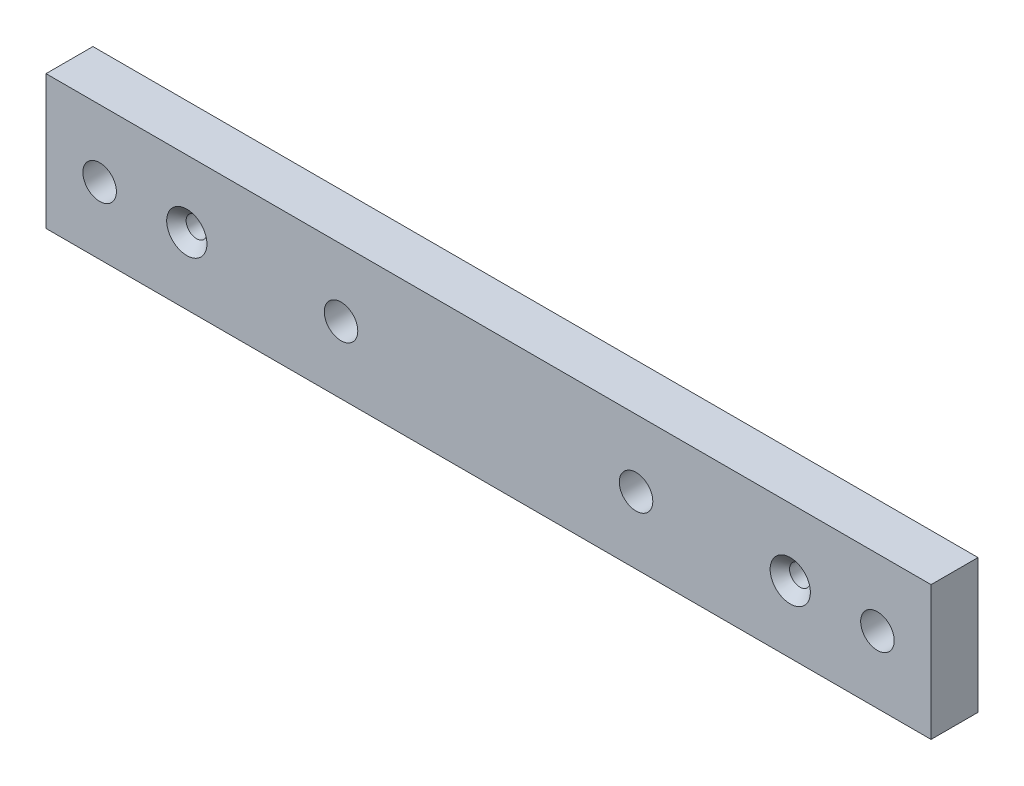
ISO-10303-21;
HEADER;
FILE_DESCRIPTION(('STEP AP214'),'2;1');
FILE_NAME('part.step','',(''),(''),'','','');
FILE_SCHEMA(('AUTOMOTIVE_DESIGN { 1 0 10303 214 1 1 1 1 }'));
ENDSEC;
DATA;
#1=APPLICATION_CONTEXT('core data for automotive mechanical design processes');
#2=APPLICATION_PROTOCOL_DEFINITION('international standard','automotive_design',2000,#1);
#3=PRODUCT_CONTEXT('',#1,'mechanical');
#4=PRODUCT('Part','Part','',(#3));
#5=PRODUCT_RELATED_PRODUCT_CATEGORY('part','',(#4));
#6=PRODUCT_DEFINITION_FORMATION('','',#4);
#7=PRODUCT_DEFINITION_CONTEXT('part definition',#1,'design');
#8=PRODUCT_DEFINITION('design','',#6,#7);
#9=PRODUCT_DEFINITION_SHAPE('','',#8);
#10=(LENGTH_UNIT() NAMED_UNIT(*) SI_UNIT(.MILLI.,.METRE.));
#11=(NAMED_UNIT(*) PLANE_ANGLE_UNIT() SI_UNIT($,.RADIAN.));
#12=(NAMED_UNIT(*) SI_UNIT($,.STERADIAN.) SOLID_ANGLE_UNIT());
#13=UNCERTAINTY_MEASURE_WITH_UNIT(LENGTH_MEASURE(1.E-05),#10,'distance_accuracy_value','');
#14=(GEOMETRIC_REPRESENTATION_CONTEXT(3) GLOBAL_UNCERTAINTY_ASSIGNED_CONTEXT((#13)) GLOBAL_UNIT_ASSIGNED_CONTEXT((#10,
#11,#12)) REPRESENTATION_CONTEXT('',''));
#15=CARTESIAN_POINT('',(0.,0.,0.));
#16=DIRECTION('',(0.,0.,1.));
#17=DIRECTION('',(1.,0.,0.));
#18=AXIS2_PLACEMENT_3D('',#15,#16,#17);
#19=CARTESIAN_POINT('',(0.,0.,7.));
#20=DIRECTION('',(0.,0.,-1.));
#21=DIRECTION('',(-1.,0.,0.));
#22=AXIS2_PLACEMENT_3D('',#19,#20,#21);
#23=PLANE('',#22);
#24=CARTESIAN_POINT('',(-58.,0.,7.));
#25=DIRECTION('',(0.,0.,1.));
#26=DIRECTION('',(1.,0.,0.));
#27=AXIS2_PLACEMENT_3D('',#24,#25,#26);
#28=CIRCLE('',#27,2.5);
#29=CARTESIAN_POINT('',(-55.5,0.,7.));
#30=VERTEX_POINT('',#29);
#31=EDGE_CURVE('E127',#30,#30,#28,.T.);
#32=ORIENTED_EDGE('',*,*,#31,.F.);
#33=EDGE_LOOP('',(#32));
#34=FACE_BOUND('',#33,.T.);
#35=CARTESIAN_POINT('',(58.,0.,7.));
#36=DIRECTION('',(0.,0.,1.));
#37=DIRECTION('',(1.,0.,0.));
#38=AXIS2_PLACEMENT_3D('',#35,#36,#37);
#39=CIRCLE('',#38,2.49999999999999);
#40=CARTESIAN_POINT('',(60.5,0.,7.));
#41=VERTEX_POINT('',#40);
#42=EDGE_CURVE('E121',#41,#41,#39,.T.);
#43=ORIENTED_EDGE('',*,*,#42,.F.);
#44=EDGE_LOOP('',(#43));
#45=FACE_BOUND('',#44,.T.);
#46=CARTESIAN_POINT('',(22.,0.,7.));
#47=DIRECTION('',(0.,0.,1.));
#48=DIRECTION('',(1.,0.,0.));
#49=AXIS2_PLACEMENT_3D('',#46,#47,#48);
#50=CIRCLE('',#49,2.5);
#51=CARTESIAN_POINT('',(24.5,0.,7.));
#52=VERTEX_POINT('',#51);
#53=EDGE_CURVE('E115',#52,#52,#50,.T.);
#54=ORIENTED_EDGE('',*,*,#53,.F.);
#55=EDGE_LOOP('',(#54));
#56=FACE_BOUND('',#55,.T.);
#57=CARTESIAN_POINT('',(-22.,0.,7.));
#58=DIRECTION('',(0.,0.,1.));
#59=DIRECTION('',(1.,0.,0.));
#60=AXIS2_PLACEMENT_3D('',#57,#58,#59);
#61=CIRCLE('',#60,2.5);
#62=CARTESIAN_POINT('',(-19.5,0.,7.));
#63=VERTEX_POINT('',#62);
#64=EDGE_CURVE('E100',#63,#63,#61,.T.);
#65=ORIENTED_EDGE('',*,*,#64,.F.);
#66=EDGE_LOOP('',(#65));
#67=FACE_BOUND('',#66,.T.);
#68=DIRECTION('',(0.,1.,0.));
#69=VECTOR('',#68,1.);
#70=CARTESIAN_POINT('',(66.,-10.,7.));
#71=LINE('',#70,#69);
#72=CARTESIAN_POINT('',(66.,-10.,7.));
#73=VERTEX_POINT('',#72);
#74=CARTESIAN_POINT('',(66.,10.,7.));
#75=VERTEX_POINT('',#74);
#76=EDGE_CURVE('E85',#73,#75,#71,.T.);
#77=ORIENTED_EDGE('',*,*,#76,.T.);
#78=DIRECTION('',(-1.,0.,0.));
#79=VECTOR('',#78,1.);
#80=CARTESIAN_POINT('',(-66.,10.,7.));
#81=LINE('',#80,#79);
#82=CARTESIAN_POINT('',(-66.,10.,7.));
#83=VERTEX_POINT('',#82);
#84=EDGE_CURVE('E80',#75,#83,#81,.T.);
#85=ORIENTED_EDGE('',*,*,#84,.T.);
#86=DIRECTION('',(0.,-1.,0.));
#87=VECTOR('',#86,1.);
#88=CARTESIAN_POINT('',(-66.,-10.,7.));
#89=LINE('',#88,#87);
#90=CARTESIAN_POINT('',(-66.,-10.,7.));
#91=VERTEX_POINT('',#90);
#92=EDGE_CURVE('E83',#83,#91,#89,.T.);
#93=ORIENTED_EDGE('',*,*,#92,.T.);
#94=DIRECTION('',(1.,0.,0.));
#95=VECTOR('',#94,1.);
#96=CARTESIAN_POINT('',(-66.,-10.,7.));
#97=LINE('',#96,#95);
#98=EDGE_CURVE('E50',#91,#73,#97,.T.);
#99=ORIENTED_EDGE('',*,*,#98,.T.);
#100=EDGE_LOOP('',(#77,#85,#93,#99));
#101=FACE_BOUND('',#100,.T.);
#102=CARTESIAN_POINT('',(45.,0.,7.));
#103=DIRECTION('',(0.,0.,1.));
#104=DIRECTION('',(1.,0.,0.));
#105=AXIS2_PLACEMENT_3D('',#102,#103,#104);
#106=CIRCLE('',#105,3.);
#107=CARTESIAN_POINT('',(48.,0.,7.));
#108=VERTEX_POINT('',#107);
#109=EDGE_CURVE('E141',#108,#108,#106,.T.);
#110=ORIENTED_EDGE('',*,*,#109,.F.);
#111=EDGE_LOOP('',(#110));
#112=FACE_BOUND('',#111,.T.);
#113=CARTESIAN_POINT('',(-45.,0.,7.));
#114=DIRECTION('',(0.,0.,1.));
#115=DIRECTION('',(1.,0.,0.));
#116=AXIS2_PLACEMENT_3D('',#113,#114,#115);
#117=CIRCLE('',#116,3.);
#118=CARTESIAN_POINT('',(-42.,0.,7.));
#119=VERTEX_POINT('',#118);
#120=EDGE_CURVE('E150',#119,#119,#117,.T.);
#121=ORIENTED_EDGE('',*,*,#120,.F.);
#122=EDGE_LOOP('',(#121));
#123=FACE_BOUND('',#122,.T.);
#124=ADVANCED_FACE('F33',(#34,#45,#56,#67,#101,#112,#123),#23,.F.);
#125=CARTESIAN_POINT('',(0.,0.,0.));
#126=DIRECTION('',(0.,0.,-1.));
#127=DIRECTION('',(-1.,0.,0.));
#128=AXIS2_PLACEMENT_3D('',#125,#126,#127);
#129=PLANE('',#128);
#130=CARTESIAN_POINT('',(-45.,0.,0.));
#131=DIRECTION('',(0.,0.,1.));
#132=DIRECTION('',(1.,0.,0.));
#133=AXIS2_PLACEMENT_3D('',#130,#131,#132);
#134=CIRCLE('',#133,1.55);
#135=CARTESIAN_POINT('',(-43.45,0.,0.));
#136=VERTEX_POINT('',#135);
#137=EDGE_CURVE('E144',#136,#136,#134,.T.);
#138=ORIENTED_EDGE('',*,*,#137,.T.);
#139=EDGE_LOOP('',(#138));
#140=FACE_BOUND('',#139,.T.);
#141=CARTESIAN_POINT('',(-58.,0.,0.));
#142=DIRECTION('',(0.,0.,1.));
#143=DIRECTION('',(1.,0.,0.));
#144=AXIS2_PLACEMENT_3D('',#141,#142,#143);
#145=CIRCLE('',#144,2.5);
#146=CARTESIAN_POINT('',(-55.5,0.,0.));
#147=VERTEX_POINT('',#146);
#148=EDGE_CURVE('E130',#147,#147,#145,.T.);
#149=ORIENTED_EDGE('',*,*,#148,.T.);
#150=EDGE_LOOP('',(#149));
#151=FACE_BOUND('',#150,.T.);
#152=CARTESIAN_POINT('',(22.,0.,0.));
#153=DIRECTION('',(0.,0.,1.));
#154=DIRECTION('',(1.,0.,0.));
#155=AXIS2_PLACEMENT_3D('',#152,#153,#154);
#156=CIRCLE('',#155,2.5);
#157=CARTESIAN_POINT('',(24.5,0.,0.));
#158=VERTEX_POINT('',#157);
#159=EDGE_CURVE('E118',#158,#158,#156,.T.);
#160=ORIENTED_EDGE('',*,*,#159,.T.);
#161=EDGE_LOOP('',(#160));
#162=FACE_BOUND('',#161,.T.);
#163=DIRECTION('',(0.,1.,0.));
#164=VECTOR('',#163,1.);
#165=CARTESIAN_POINT('',(66.,-10.,0.));
#166=LINE('',#165,#164);
#167=CARTESIAN_POINT('',(66.,-10.,0.));
#168=VERTEX_POINT('',#167);
#169=CARTESIAN_POINT('',(66.,10.,0.));
#170=VERTEX_POINT('',#169);
#171=EDGE_CURVE('E97',#168,#170,#166,.T.);
#172=ORIENTED_EDGE('',*,*,#171,.F.);
#173=DIRECTION('',(1.,0.,0.));
#174=VECTOR('',#173,1.);
#175=CARTESIAN_POINT('',(-66.,-10.,0.));
#176=LINE('',#175,#174);
#177=CARTESIAN_POINT('',(-66.,-10.,0.));
#178=VERTEX_POINT('',#177);
#179=EDGE_CURVE('E73',#178,#168,#176,.T.);
#180=ORIENTED_EDGE('',*,*,#179,.F.);
#181=DIRECTION('',(0.,-1.,0.));
#182=VECTOR('',#181,1.);
#183=CARTESIAN_POINT('',(-66.,-10.,0.));
#184=LINE('',#183,#182);
#185=CARTESIAN_POINT('',(-66.,10.,0.));
#186=VERTEX_POINT('',#185);
#187=EDGE_CURVE('E67',#186,#178,#184,.T.);
#188=ORIENTED_EDGE('',*,*,#187,.F.);
#189=DIRECTION('',(-1.,0.,0.));
#190=VECTOR('',#189,1.);
#191=CARTESIAN_POINT('',(-66.,10.,0.));
#192=LINE('',#191,#190);
#193=EDGE_CURVE('E89',#170,#186,#192,.T.);
#194=ORIENTED_EDGE('',*,*,#193,.F.);
#195=EDGE_LOOP('',(#172,#180,#188,#194));
#196=FACE_BOUND('',#195,.T.);
#197=CARTESIAN_POINT('',(-22.,0.,0.));
#198=DIRECTION('',(0.,0.,1.));
#199=DIRECTION('',(1.,0.,0.));
#200=AXIS2_PLACEMENT_3D('',#197,#198,#199);
#201=CIRCLE('',#200,2.5);
#202=CARTESIAN_POINT('',(-19.5,0.,0.));
#203=VERTEX_POINT('',#202);
#204=EDGE_CURVE('E112',#203,#203,#201,.T.);
#205=ORIENTED_EDGE('',*,*,#204,.T.);
#206=EDGE_LOOP('',(#205));
#207=FACE_BOUND('',#206,.T.);
#208=CARTESIAN_POINT('',(58.,0.,0.));
#209=DIRECTION('',(0.,0.,1.));
#210=DIRECTION('',(1.,0.,0.));
#211=AXIS2_PLACEMENT_3D('',#208,#209,#210);
#212=CIRCLE('',#211,2.49999999999999);
#213=CARTESIAN_POINT('',(60.5,0.,0.));
#214=VERTEX_POINT('',#213);
#215=EDGE_CURVE('E124',#214,#214,#212,.T.);
#216=ORIENTED_EDGE('',*,*,#215,.T.);
#217=EDGE_LOOP('',(#216));
#218=FACE_BOUND('',#217,.T.);
#219=CARTESIAN_POINT('',(45.,0.,0.));
#220=DIRECTION('',(0.,0.,1.));
#221=DIRECTION('',(1.,0.,0.));
#222=AXIS2_PLACEMENT_3D('',#219,#220,#221);
#223=CIRCLE('',#222,1.55);
#224=CARTESIAN_POINT('',(46.55,0.,0.));
#225=VERTEX_POINT('',#224);
#226=EDGE_CURVE('E133',#225,#225,#223,.T.);
#227=ORIENTED_EDGE('',*,*,#226,.T.);
#228=EDGE_LOOP('',(#227));
#229=FACE_BOUND('',#228,.T.);
#230=ADVANCED_FACE('F108',(#140,#151,#162,#196,#207,#218,#229),#129,.T.);
#231=CARTESIAN_POINT('',(66.,-10.,7.));
#232=DIRECTION('',(-1.,0.,0.));
#233=DIRECTION('',(0.,0.,1.));
#234=AXIS2_PLACEMENT_3D('',#231,#232,#233);
#235=PLANE('',#234);
#236=ORIENTED_EDGE('',*,*,#171,.T.);
#237=DIRECTION('',(0.,0.,-1.));
#238=VECTOR('',#237,1.);
#239=CARTESIAN_POINT('',(66.,10.,7.));
#240=LINE('',#239,#238);
#241=EDGE_CURVE('E11',#75,#170,#240,.T.);
#242=ORIENTED_EDGE('',*,*,#241,.F.);
#243=ORIENTED_EDGE('',*,*,#76,.F.);
#244=DIRECTION('',(0.,0.,-1.));
#245=VECTOR('',#244,1.);
#246=CARTESIAN_POINT('',(66.,-10.,7.));
#247=LINE('',#246,#245);
#248=EDGE_CURVE('E93',#73,#168,#247,.T.);
#249=ORIENTED_EDGE('',*,*,#248,.T.);
#250=EDGE_LOOP('',(#236,#242,#243,#249));
#251=FACE_BOUND('',#250,.T.);
#252=ADVANCED_FACE('F35',(#251),#235,.F.);
#253=CARTESIAN_POINT('',(-66.,10.,7.));
#254=DIRECTION('',(0.,-1.,0.));
#255=DIRECTION('',(0.,0.,-1.));
#256=AXIS2_PLACEMENT_3D('',#253,#254,#255);
#257=PLANE('',#256);
#258=ORIENTED_EDGE('',*,*,#193,.T.);
#259=DIRECTION('',(0.,0.,-1.));
#260=VECTOR('',#259,1.);
#261=CARTESIAN_POINT('',(-66.,10.,7.));
#262=LINE('',#261,#260);
#263=EDGE_CURVE('E42',#83,#186,#262,.T.);
#264=ORIENTED_EDGE('',*,*,#263,.F.);
#265=ORIENTED_EDGE('',*,*,#84,.F.);
#266=ORIENTED_EDGE('',*,*,#241,.T.);
#267=EDGE_LOOP('',(#258,#264,#265,#266));
#268=FACE_BOUND('',#267,.T.);
#269=ADVANCED_FACE('F88',(#268),#257,.F.);
#270=CARTESIAN_POINT('',(-66.,-10.,7.));
#271=DIRECTION('',(1.,0.,0.));
#272=DIRECTION('',(0.,0.,-1.));
#273=AXIS2_PLACEMENT_3D('',#270,#271,#272);
#274=PLANE('',#273);
#275=ORIENTED_EDGE('',*,*,#187,.T.);
#276=DIRECTION('',(0.,0.,-1.));
#277=VECTOR('',#276,1.);
#278=CARTESIAN_POINT('',(-66.,-10.,7.));
#279=LINE('',#278,#277);
#280=EDGE_CURVE('E90',#91,#178,#279,.T.);
#281=ORIENTED_EDGE('',*,*,#280,.F.);
#282=ORIENTED_EDGE('',*,*,#92,.F.);
#283=ORIENTED_EDGE('',*,*,#263,.T.);
#284=EDGE_LOOP('',(#275,#281,#282,#283));
#285=FACE_BOUND('',#284,.T.);
#286=ADVANCED_FACE('F91',(#285),#274,.F.);
#287=CARTESIAN_POINT('',(-66.,-10.,7.));
#288=DIRECTION('',(0.,1.,0.));
#289=DIRECTION('',(0.,0.,1.));
#290=AXIS2_PLACEMENT_3D('',#287,#288,#289);
#291=PLANE('',#290);
#292=ORIENTED_EDGE('',*,*,#179,.T.);
#293=ORIENTED_EDGE('',*,*,#248,.F.);
#294=ORIENTED_EDGE('',*,*,#98,.F.);
#295=ORIENTED_EDGE('',*,*,#280,.T.);
#296=EDGE_LOOP('',(#292,#293,#294,#295));
#297=FACE_BOUND('',#296,.T.);
#298=ADVANCED_FACE('F105',(#297),#291,.F.);
#299=CARTESIAN_POINT('',(-22.,0.,7.));
#300=DIRECTION('',(0.,0.,-1.));
#301=DIRECTION('',(-1.,0.,0.));
#302=AXIS2_PLACEMENT_3D('',#299,#300,#301);
#303=CYLINDRICAL_SURFACE('',#302,2.5);
#304=ORIENTED_EDGE('',*,*,#64,.T.);
#305=EDGE_LOOP('',(#304));
#306=FACE_BOUND('',#305,.T.);
#307=ORIENTED_EDGE('',*,*,#204,.F.);
#308=EDGE_LOOP('',(#307));
#309=FACE_BOUND('',#308,.T.);
#310=ADVANCED_FACE('F167',(#306,#309),#303,.F.);
#311=CARTESIAN_POINT('',(22.,0.,7.));
#312=DIRECTION('',(0.,0.,-1.));
#313=DIRECTION('',(-1.,0.,0.));
#314=AXIS2_PLACEMENT_3D('',#311,#312,#313);
#315=CYLINDRICAL_SURFACE('',#314,2.5);
#316=ORIENTED_EDGE('',*,*,#53,.T.);
#317=EDGE_LOOP('',(#316));
#318=FACE_BOUND('',#317,.T.);
#319=ORIENTED_EDGE('',*,*,#159,.F.);
#320=EDGE_LOOP('',(#319));
#321=FACE_BOUND('',#320,.T.);
#322=ADVANCED_FACE('F238',(#318,#321),#315,.F.);
#323=CARTESIAN_POINT('',(58.,0.,7.));
#324=DIRECTION('',(0.,0.,-1.));
#325=DIRECTION('',(-1.,0.,0.));
#326=AXIS2_PLACEMENT_3D('',#323,#324,#325);
#327=CYLINDRICAL_SURFACE('',#326,2.49999999999999);
#328=ORIENTED_EDGE('',*,*,#42,.T.);
#329=EDGE_LOOP('',(#328));
#330=FACE_BOUND('',#329,.T.);
#331=ORIENTED_EDGE('',*,*,#215,.F.);
#332=EDGE_LOOP('',(#331));
#333=FACE_BOUND('',#332,.T.);
#334=ADVANCED_FACE('F235',(#330,#333),#327,.F.);
#335=CARTESIAN_POINT('',(-58.,0.,7.));
#336=DIRECTION('',(0.,0.,-1.));
#337=DIRECTION('',(-1.,0.,0.));
#338=AXIS2_PLACEMENT_3D('',#335,#336,#337);
#339=CYLINDRICAL_SURFACE('',#338,2.5);
#340=ORIENTED_EDGE('',*,*,#31,.T.);
#341=EDGE_LOOP('',(#340));
#342=FACE_BOUND('',#341,.T.);
#343=ORIENTED_EDGE('',*,*,#148,.F.);
#344=EDGE_LOOP('',(#343));
#345=FACE_BOUND('',#344,.T.);
#346=ADVANCED_FACE('F198',(#342,#345),#339,.F.);
#347=CARTESIAN_POINT('',(45.,0.,7.));
#348=DIRECTION('',(0.,0.,1.));
#349=DIRECTION('',(1.,0.,0.));
#350=AXIS2_PLACEMENT_3D('',#347,#348,#349);
#351=CYLINDRICAL_SURFACE('',#350,1.55);
#352=ORIENTED_EDGE('',*,*,#226,.F.);
#353=EDGE_LOOP('',(#352));
#354=FACE_BOUND('',#353,.T.);
#355=CARTESIAN_POINT('',(45.,0.,5.55));
#356=DIRECTION('',(0.,0.,1.));
#357=DIRECTION('',(1.,0.,0.));
#358=AXIS2_PLACEMENT_3D('',#355,#356,#357);
#359=CIRCLE('',#358,1.55);
#360=CARTESIAN_POINT('',(46.55,0.,5.55));
#361=VERTEX_POINT('',#360);
#362=EDGE_CURVE('E138',#361,#361,#359,.T.);
#363=ORIENTED_EDGE('',*,*,#362,.T.);
#364=EDGE_LOOP('',(#363));
#365=FACE_BOUND('',#364,.T.);
#366=ADVANCED_FACE('F192',(#354,#365),#351,.F.);
#367=CARTESIAN_POINT('',(45.,0.,7.));
#368=DIRECTION('',(0.,0.,1.));
#369=DIRECTION('',(1.,0.,0.));
#370=AXIS2_PLACEMENT_3D('',#367,#368,#369);
#371=CONICAL_SURFACE('',#370,3.,0.78539816339745);
#372=ORIENTED_EDGE('',*,*,#362,.F.);
#373=EDGE_LOOP('',(#372));
#374=FACE_BOUND('',#373,.T.);
#375=ORIENTED_EDGE('',*,*,#109,.T.);
#376=EDGE_LOOP('',(#375));
#377=FACE_BOUND('',#376,.T.);
#378=ADVANCED_FACE('F197',(#374,#377),#371,.F.);
#379=CARTESIAN_POINT('',(-45.,0.,7.));
#380=DIRECTION('',(0.,0.,1.));
#381=DIRECTION('',(1.,0.,0.));
#382=AXIS2_PLACEMENT_3D('',#379,#380,#381);
#383=CYLINDRICAL_SURFACE('',#382,1.55);
#384=ORIENTED_EDGE('',*,*,#137,.F.);
#385=EDGE_LOOP('',(#384));
#386=FACE_BOUND('',#385,.T.);
#387=CARTESIAN_POINT('',(-45.,0.,5.55));
#388=DIRECTION('',(0.,0.,1.));
#389=DIRECTION('',(1.,0.,0.));
#390=AXIS2_PLACEMENT_3D('',#387,#388,#389);
#391=CIRCLE('',#390,1.55);
#392=CARTESIAN_POINT('',(-43.45,0.,5.55));
#393=VERTEX_POINT('',#392);
#394=EDGE_CURVE('E147',#393,#393,#391,.T.);
#395=ORIENTED_EDGE('',*,*,#394,.T.);
#396=EDGE_LOOP('',(#395));
#397=FACE_BOUND('',#396,.T.);
#398=ADVANCED_FACE('F209',(#386,#397),#383,.F.);
#399=CARTESIAN_POINT('',(-45.,0.,7.));
#400=DIRECTION('',(0.,0.,1.));
#401=DIRECTION('',(1.,0.,0.));
#402=AXIS2_PLACEMENT_3D('',#399,#400,#401);
#403=CONICAL_SURFACE('',#402,3.,0.78539816339745);
#404=ORIENTED_EDGE('',*,*,#394,.F.);
#405=EDGE_LOOP('',(#404));
#406=FACE_BOUND('',#405,.T.);
#407=ORIENTED_EDGE('',*,*,#120,.T.);
#408=EDGE_LOOP('',(#407));
#409=FACE_BOUND('',#408,.T.);
#410=ADVANCED_FACE('F154',(#406,#409),#403,.F.);
#411=CLOSED_SHELL('',(#124,#230,#252,#269,#286,#298,#310,#322,#334,#346,#366,#378,#398,#410));
#412=MANIFOLD_SOLID_BREP('B2',#411);
#413=ADVANCED_BREP_SHAPE_REPRESENTATION('',(#18,#412),#14);
#414=SHAPE_DEFINITION_REPRESENTATION(#9,#413);
ENDSEC;
END-ISO-10303-21;
